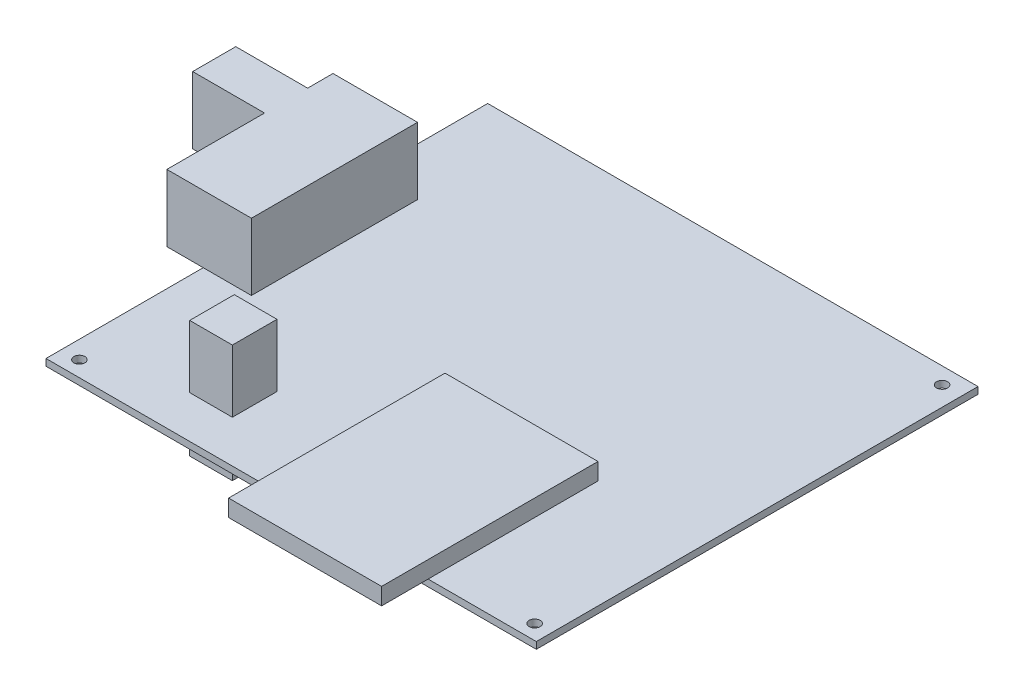
ISO-10303-21;
HEADER;
FILE_DESCRIPTION(('STEP AP214'),'2;1');
FILE_NAME('part.step','',(''),(''),'','','');
FILE_SCHEMA(('AUTOMOTIVE_DESIGN { 1 0 10303 214 1 1 1 1 }'));
ENDSEC;
DATA;
#1=APPLICATION_CONTEXT('core data for automotive mechanical design processes');
#2=APPLICATION_PROTOCOL_DEFINITION('international standard','automotive_design',2000,#1);
#3=PRODUCT_CONTEXT('',#1,'mechanical');
#4=PRODUCT('Part','Part','',(#3));
#5=PRODUCT_RELATED_PRODUCT_CATEGORY('part','',(#4));
#6=PRODUCT_DEFINITION_FORMATION('','',#4);
#7=PRODUCT_DEFINITION_CONTEXT('part definition',#1,'design');
#8=PRODUCT_DEFINITION('design','',#6,#7);
#9=PRODUCT_DEFINITION_SHAPE('','',#8);
#10=(LENGTH_UNIT() NAMED_UNIT(*) SI_UNIT(.MILLI.,.METRE.));
#11=(NAMED_UNIT(*) PLANE_ANGLE_UNIT() SI_UNIT($,.RADIAN.));
#12=(NAMED_UNIT(*) SI_UNIT($,.STERADIAN.) SOLID_ANGLE_UNIT());
#13=UNCERTAINTY_MEASURE_WITH_UNIT(LENGTH_MEASURE(1.E-05),#10,'distance_accuracy_value','');
#14=(GEOMETRIC_REPRESENTATION_CONTEXT(3) GLOBAL_UNCERTAINTY_ASSIGNED_CONTEXT((#13)) GLOBAL_UNIT_ASSIGNED_CONTEXT((#10,
#11,#12)) REPRESENTATION_CONTEXT('',''));
#15=CARTESIAN_POINT('',(0.,0.,0.));
#16=DIRECTION('',(0.,0.,1.));
#17=DIRECTION('',(1.,0.,0.));
#18=AXIS2_PLACEMENT_3D('',#15,#16,#17);
#19=CARTESIAN_POINT('',(0.,-0.8,0.));
#20=DIRECTION('',(0.,1.,0.));
#21=DIRECTION('',(0.,0.,1.));
#22=AXIS2_PLACEMENT_3D('',#19,#20,#21);
#23=PLANE('',#22);
#24=DIRECTION('',(1.,0.,0.));
#25=VECTOR('',#24,1.);
#26=CARTESIAN_POINT('',(0.,-0.8,-52.25));
#27=LINE('',#26,#25);
#28=CARTESIAN_POINT('',(0.,-0.8,-52.25));
#29=VERTEX_POINT('',#28);
#30=CARTESIAN_POINT('',(58.,-0.8,-52.25));
#31=VERTEX_POINT('',#30);
#32=EDGE_CURVE('E363',#29,#31,#27,.T.);
#33=ORIENTED_EDGE('',*,*,#32,.T.);
#34=DIRECTION('',(0.,0.,-1.));
#35=VECTOR('',#34,1.);
#36=CARTESIAN_POINT('',(58.,-0.8,0.));
#37=LINE('',#36,#35);
#38=CARTESIAN_POINT('',(58.,-0.8,0.));
#39=VERTEX_POINT('',#38);
#40=EDGE_CURVE('E370',#39,#31,#37,.T.);
#41=ORIENTED_EDGE('',*,*,#40,.F.);
#42=DIRECTION('',(1.,0.,0.));
#43=VECTOR('',#42,1.);
#44=CARTESIAN_POINT('',(0.,-0.8,0.));
#45=LINE('',#44,#43);
#46=CARTESIAN_POINT('',(0.,-0.8,0.));
#47=VERTEX_POINT('',#46);
#48=EDGE_CURVE('E367',#47,#39,#45,.T.);
#49=ORIENTED_EDGE('',*,*,#48,.F.);
#50=DIRECTION('',(0.,0.,-1.));
#51=VECTOR('',#50,1.);
#52=CARTESIAN_POINT('',(0.,-0.8,0.));
#53=LINE('',#52,#51);
#54=EDGE_CURVE('E365',#47,#29,#53,.T.);
#55=ORIENTED_EDGE('',*,*,#54,.T.);
#56=EDGE_LOOP('',(#33,#41,#49,#55));
#57=FACE_BOUND('',#56,.T.);
#58=CARTESIAN_POINT('',(2.1,-0.8,-1.85));
#59=DIRECTION('',(0.,1.,0.));
#60=DIRECTION('',(0.,0.,1.));
#61=AXIS2_PLACEMENT_3D('',#58,#59,#60);
#62=CIRCLE('',#61,0.65);
#63=CARTESIAN_POINT('',(2.1,-0.8,-1.2));
#64=VERTEX_POINT('',#63);
#65=EDGE_CURVE('E360',#64,#64,#62,.T.);
#66=ORIENTED_EDGE('',*,*,#65,.T.);
#67=EDGE_LOOP('',(#66));
#68=FACE_BOUND('',#67,.T.);
#69=CARTESIAN_POINT('',(56.05,-0.8,-1.75000000000001));
#70=DIRECTION('',(0.,1.,0.));
#71=DIRECTION('',(0.,0.,1.));
#72=AXIS2_PLACEMENT_3D('',#69,#70,#71);
#73=CIRCLE('',#72,0.649999999999997);
#74=CARTESIAN_POINT('',(56.05,-0.8,-1.10000000000001));
#75=VERTEX_POINT('',#74);
#76=EDGE_CURVE('E356',#75,#75,#73,.T.);
#77=ORIENTED_EDGE('',*,*,#76,.T.);
#78=EDGE_LOOP('',(#77));
#79=FACE_BOUND('',#78,.T.);
#80=CARTESIAN_POINT('',(55.7,-0.8,-50.3));
#81=DIRECTION('',(0.,1.,0.));
#82=DIRECTION('',(0.,0.,1.));
#83=AXIS2_PLACEMENT_3D('',#80,#81,#82);
#84=CIRCLE('',#83,0.649999999999997);
#85=CARTESIAN_POINT('',(55.7,-0.8,-49.65));
#86=VERTEX_POINT('',#85);
#87=EDGE_CURVE('E353',#86,#86,#84,.T.);
#88=ORIENTED_EDGE('',*,*,#87,.T.);
#89=EDGE_LOOP('',(#88));
#90=FACE_BOUND('',#89,.T.);
#91=DIRECTION('',(-1.,0.,0.));
#92=VECTOR('',#91,1.);
#93=CARTESIAN_POINT('',(0.,-0.8,-5.));
#94=LINE('',#93,#92);
#95=CARTESIAN_POINT('',(17.0479572916378,-0.8,-5.));
#96=VERTEX_POINT('',#95);
#97=CARTESIAN_POINT('',(12.,-0.8,-5.));
#98=VERTEX_POINT('',#97);
#99=EDGE_CURVE('E49',#96,#98,#94,.T.);
#100=ORIENTED_EDGE('',*,*,#99,.F.);
#101=DIRECTION('',(0.,0.,-1.));
#102=VECTOR('',#101,1.);
#103=CARTESIAN_POINT('',(17.0479572916378,-0.8,0.));
#104=LINE('',#103,#102);
#105=CARTESIAN_POINT('',(17.0479572916378,-0.8,-10.2760060902983));
#106=VERTEX_POINT('',#105);
#107=EDGE_CURVE('E53',#96,#106,#104,.T.);
#108=ORIENTED_EDGE('',*,*,#107,.T.);
#109=DIRECTION('',(-1.,0.,0.));
#110=VECTOR('',#109,1.);
#111=CARTESIAN_POINT('',(0.,-0.8,-10.2760060902983));
#112=LINE('',#111,#110);
#113=CARTESIAN_POINT('',(12.,-0.8,-10.2760060902983));
#114=VERTEX_POINT('',#113);
#115=EDGE_CURVE('E256',#106,#114,#112,.T.);
#116=ORIENTED_EDGE('',*,*,#115,.T.);
#117=DIRECTION('',(0.,0.,-1.));
#118=VECTOR('',#117,1.);
#119=CARTESIAN_POINT('',(12.,-0.8,0.));
#120=LINE('',#119,#118);
#121=EDGE_CURVE('E253',#98,#114,#120,.T.);
#122=ORIENTED_EDGE('',*,*,#121,.F.);
#123=EDGE_LOOP('',(#100,#108,#116,#122));
#124=FACE_BOUND('',#123,.T.);
#125=ADVANCED_FACE('F34',(#57,#68,#79,#90,#124),#23,.F.);
#126=CARTESIAN_POINT('',(0.,0.,0.));
#127=DIRECTION('',(0.,1.,0.));
#128=DIRECTION('',(0.,0.,1.));
#129=AXIS2_PLACEMENT_3D('',#126,#127,#128);
#130=PLANE('',#129);
#131=DIRECTION('',(0.,0.,1.));
#132=VECTOR('',#131,1.);
#133=CARTESIAN_POINT('',(27.1,0.,0.));
#134=LINE('',#133,#132);
#135=CARTESIAN_POINT('',(27.1,0.,-20.1));
#136=VERTEX_POINT('',#135);
#137=CARTESIAN_POINT('',(27.1,0.,0.));
#138=VERTEX_POINT('',#137);
#139=EDGE_CURVE('E408',#136,#138,#134,.T.);
#140=ORIENTED_EDGE('',*,*,#139,.F.);
#141=DIRECTION('',(1.,0.,0.));
#142=VECTOR('',#141,1.);
#143=CARTESIAN_POINT('',(0.,0.,-20.1));
#144=LINE('',#143,#142);
#145=CARTESIAN_POINT('',(45.2,0.,-20.1));
#146=VERTEX_POINT('',#145);
#147=EDGE_CURVE('E265',#136,#146,#144,.T.);
#148=ORIENTED_EDGE('',*,*,#147,.T.);
#149=DIRECTION('',(0.,0.,1.));
#150=VECTOR('',#149,1.);
#151=CARTESIAN_POINT('',(45.2,0.,0.));
#152=LINE('',#151,#150);
#153=CARTESIAN_POINT('',(45.2,0.,0.));
#154=VERTEX_POINT('',#153);
#155=EDGE_CURVE('E406',#146,#154,#152,.T.);
#156=ORIENTED_EDGE('',*,*,#155,.T.);
#157=DIRECTION('',(1.,0.,0.));
#158=VECTOR('',#157,1.);
#159=CARTESIAN_POINT('',(0.,0.,0.));
#160=LINE('',#159,#158);
#161=CARTESIAN_POINT('',(58.,0.,0.));
#162=VERTEX_POINT('',#161);
#163=EDGE_CURVE('E389',#154,#162,#160,.T.);
#164=ORIENTED_EDGE('',*,*,#163,.T.);
#165=DIRECTION('',(0.,0.,-1.));
#166=VECTOR('',#165,1.);
#167=CARTESIAN_POINT('',(58.,0.,0.));
#168=LINE('',#167,#166);
#169=CARTESIAN_POINT('',(58.,0.,-52.25));
#170=VERTEX_POINT('',#169);
#171=EDGE_CURVE('E357',#162,#170,#168,.T.);
#172=ORIENTED_EDGE('',*,*,#171,.T.);
#173=DIRECTION('',(1.,0.,0.));
#174=VECTOR('',#173,1.);
#175=CARTESIAN_POINT('',(0.,0.,-52.25));
#176=LINE('',#175,#174);
#177=CARTESIAN_POINT('',(0.,0.,-52.25));
#178=VERTEX_POINT('',#177);
#179=EDGE_CURVE('E382',#178,#170,#176,.T.);
#180=ORIENTED_EDGE('',*,*,#179,.F.);
#181=DIRECTION('',(0.,0.,-1.));
#182=VECTOR('',#181,1.);
#183=CARTESIAN_POINT('',(0.,0.,0.));
#184=LINE('',#183,#182);
#185=CARTESIAN_POINT('',(0.,0.,-38.25));
#186=VERTEX_POINT('',#185);
#187=EDGE_CURVE('E385',#186,#178,#184,.T.);
#188=ORIENTED_EDGE('',*,*,#187,.F.);
#189=DIRECTION('',(1.,0.,0.));
#190=VECTOR('',#189,1.);
#191=CARTESIAN_POINT('',(0.,0.,-38.25));
#192=LINE('',#191,#190);
#193=CARTESIAN_POINT('',(5.7,0.,-38.25));
#194=VERTEX_POINT('',#193);
#195=EDGE_CURVE('E318',#186,#194,#192,.T.);
#196=ORIENTED_EDGE('',*,*,#195,.T.);
#197=DIRECTION('',(0.,0.,1.));
#198=VECTOR('',#197,1.);
#199=CARTESIAN_POINT('',(5.70000000000001,0.,0.));
#200=LINE('',#199,#198);
#201=CARTESIAN_POINT('',(5.7,0.,-18.6));
#202=VERTEX_POINT('',#201);
#203=EDGE_CURVE('E291',#194,#202,#200,.T.);
#204=ORIENTED_EDGE('',*,*,#203,.T.);
#205=DIRECTION('',(1.,0.,0.));
#206=VECTOR('',#205,1.);
#207=CARTESIAN_POINT('',(0.,0.,-18.6));
#208=LINE('',#207,#206);
#209=CARTESIAN_POINT('',(0.,0.,-18.6));
#210=VERTEX_POINT('',#209);
#211=EDGE_CURVE('E331',#210,#202,#208,.T.);
#212=ORIENTED_EDGE('',*,*,#211,.F.);
#213=CARTESIAN_POINT('',(0.,0.,0.));
#214=VERTEX_POINT('',#213);
#215=EDGE_CURVE('E386',#214,#210,#184,.T.);
#216=ORIENTED_EDGE('',*,*,#215,.F.);
#217=EDGE_CURVE('E391',#214,#138,#160,.T.);
#218=ORIENTED_EDGE('',*,*,#217,.T.);
#219=EDGE_LOOP('',(#140,#148,#156,#164,#172,#180,#188,#196,#204,#212,#216,#218));
#220=FACE_BOUND('',#219,.T.);
#221=CARTESIAN_POINT('',(55.7,0.,-50.3));
#222=DIRECTION('',(0.,1.,0.));
#223=DIRECTION('',(0.,0.,1.));
#224=AXIS2_PLACEMENT_3D('',#221,#222,#223);
#225=CIRCLE('',#224,0.649999999999997);
#226=CARTESIAN_POINT('',(55.7,0.,-49.65));
#227=VERTEX_POINT('',#226);
#228=EDGE_CURVE('E352',#227,#227,#225,.T.);
#229=ORIENTED_EDGE('',*,*,#228,.F.);
#230=EDGE_LOOP('',(#229));
#231=FACE_BOUND('',#230,.T.);
#232=CARTESIAN_POINT('',(56.05,0.,-1.75000000000001));
#233=DIRECTION('',(0.,1.,0.));
#234=DIRECTION('',(0.,0.,1.));
#235=AXIS2_PLACEMENT_3D('',#232,#233,#234);
#236=CIRCLE('',#235,0.649999999999997);
#237=CARTESIAN_POINT('',(56.05,0.,-1.10000000000001));
#238=VERTEX_POINT('',#237);
#239=EDGE_CURVE('E376',#238,#238,#236,.T.);
#240=ORIENTED_EDGE('',*,*,#239,.F.);
#241=EDGE_LOOP('',(#240));
#242=FACE_BOUND('',#241,.T.);
#243=CARTESIAN_POINT('',(2.1,0.,-1.85));
#244=DIRECTION('',(0.,1.,0.));
#245=DIRECTION('',(0.,0.,1.));
#246=AXIS2_PLACEMENT_3D('',#243,#244,#245);
#247=CIRCLE('',#246,0.65);
#248=CARTESIAN_POINT('',(2.1,0.,-1.2));
#249=VERTEX_POINT('',#248);
#250=EDGE_CURVE('E379',#249,#249,#247,.T.);
#251=ORIENTED_EDGE('',*,*,#250,.F.);
#252=EDGE_LOOP('',(#251));
#253=FACE_BOUND('',#252,.T.);
#254=DIRECTION('',(0.,0.,-1.));
#255=VECTOR('',#254,1.);
#256=CARTESIAN_POINT('',(17.0479572916378,0.,0.));
#257=LINE('',#256,#255);
#258=CARTESIAN_POINT('',(17.0479572916378,0.,-5.));
#259=VERTEX_POINT('',#258);
#260=CARTESIAN_POINT('',(17.0479572916378,0.,-10.2760060902983));
#261=VERTEX_POINT('',#260);
#262=EDGE_CURVE('E42',#259,#261,#257,.T.);
#263=ORIENTED_EDGE('',*,*,#262,.F.);
#264=DIRECTION('',(-1.,0.,0.));
#265=VECTOR('',#264,1.);
#266=CARTESIAN_POINT('',(0.,0.,-5.));
#267=LINE('',#266,#265);
#268=CARTESIAN_POINT('',(12.,0.,-5.));
#269=VERTEX_POINT('',#268);
#270=EDGE_CURVE('E11',#259,#269,#267,.T.);
#271=ORIENTED_EDGE('',*,*,#270,.T.);
#272=DIRECTION('',(0.,0.,-1.));
#273=VECTOR('',#272,1.);
#274=CARTESIAN_POINT('',(12.,0.,0.));
#275=LINE('',#274,#273);
#276=CARTESIAN_POINT('',(12.,0.,-10.2760060902983));
#277=VERTEX_POINT('',#276);
#278=EDGE_CURVE('E411',#269,#277,#275,.T.);
#279=ORIENTED_EDGE('',*,*,#278,.T.);
#280=DIRECTION('',(-1.,0.,0.));
#281=VECTOR('',#280,1.);
#282=CARTESIAN_POINT('',(0.,0.,-10.2760060902983));
#283=LINE('',#282,#281);
#284=EDGE_CURVE('E414',#261,#277,#283,.T.);
#285=ORIENTED_EDGE('',*,*,#284,.F.);
#286=EDGE_LOOP('',(#263,#271,#279,#285));
#287=FACE_BOUND('',#286,.T.);
#288=ADVANCED_FACE('F426',(#220,#231,#242,#253,#287),#130,.T.);
#289=CARTESIAN_POINT('',(0.,-0.8,-52.25));
#290=DIRECTION('',(0.,0.,1.));
#291=DIRECTION('',(1.,0.,0.));
#292=AXIS2_PLACEMENT_3D('',#289,#290,#291);
#293=PLANE('',#292);
#294=ORIENTED_EDGE('',*,*,#179,.T.);
#295=DIRECTION('',(0.,1.,0.));
#296=VECTOR('',#295,1.);
#297=CARTESIAN_POINT('',(58.,-0.8,-52.25));
#298=LINE('',#297,#296);
#299=EDGE_CURVE('E397',#31,#170,#298,.T.);
#300=ORIENTED_EDGE('',*,*,#299,.F.);
#301=ORIENTED_EDGE('',*,*,#32,.F.);
#302=DIRECTION('',(0.,1.,0.));
#303=VECTOR('',#302,1.);
#304=CARTESIAN_POINT('',(0.,-0.8,-52.25));
#305=LINE('',#304,#303);
#306=EDGE_CURVE('E373',#29,#178,#305,.T.);
#307=ORIENTED_EDGE('',*,*,#306,.T.);
#308=EDGE_LOOP('',(#294,#300,#301,#307));
#309=FACE_BOUND('',#308,.T.);
#310=ADVANCED_FACE('F455',(#309),#293,.F.);
#311=CARTESIAN_POINT('',(58.,-0.8,0.));
#312=DIRECTION('',(1.,0.,0.));
#313=DIRECTION('',(0.,0.,-1.));
#314=AXIS2_PLACEMENT_3D('',#311,#312,#313);
#315=PLANE('',#314);
#316=ORIENTED_EDGE('',*,*,#171,.F.);
#317=DIRECTION('',(0.,1.,0.));
#318=VECTOR('',#317,1.);
#319=CARTESIAN_POINT('',(58.,-0.8,0.));
#320=LINE('',#319,#318);
#321=EDGE_CURVE('E399',#39,#162,#320,.T.);
#322=ORIENTED_EDGE('',*,*,#321,.F.);
#323=ORIENTED_EDGE('',*,*,#40,.T.);
#324=ORIENTED_EDGE('',*,*,#299,.T.);
#325=EDGE_LOOP('',(#316,#322,#323,#324));
#326=FACE_BOUND('',#325,.T.);
#327=ADVANCED_FACE('F463',(#326),#315,.T.);
#328=CARTESIAN_POINT('',(0.,-0.8,0.));
#329=DIRECTION('',(0.,0.,1.));
#330=DIRECTION('',(1.,0.,0.));
#331=AXIS2_PLACEMENT_3D('',#328,#329,#330);
#332=PLANE('',#331);
#333=ORIENTED_EDGE('',*,*,#217,.F.);
#334=DIRECTION('',(0.,1.,0.));
#335=VECTOR('',#334,1.);
#336=CARTESIAN_POINT('',(0.,-0.8,0.));
#337=LINE('',#336,#335);
#338=EDGE_CURVE('E402',#47,#214,#337,.T.);
#339=ORIENTED_EDGE('',*,*,#338,.F.);
#340=ORIENTED_EDGE('',*,*,#48,.T.);
#341=ORIENTED_EDGE('',*,*,#321,.T.);
#342=ORIENTED_EDGE('',*,*,#163,.F.);
#343=EDGE_CURVE('E394',#138,#154,#160,.T.);
#344=ORIENTED_EDGE('',*,*,#343,.F.);
#345=EDGE_LOOP('',(#333,#339,#340,#341,#342,#344));
#346=FACE_BOUND('',#345,.T.);
#347=ADVANCED_FACE('F466',(#346),#332,.T.);
#348=CARTESIAN_POINT('',(2.1,-0.8,-1.85));
#349=DIRECTION('',(0.,1.,0.));
#350=DIRECTION('',(0.,0.,1.));
#351=AXIS2_PLACEMENT_3D('',#348,#349,#350);
#352=CYLINDRICAL_SURFACE('',#351,0.65);
#353=ORIENTED_EDGE('',*,*,#65,.F.);
#354=EDGE_LOOP('',(#353));
#355=FACE_BOUND('',#354,.T.);
#356=ORIENTED_EDGE('',*,*,#250,.T.);
#357=EDGE_LOOP('',(#356));
#358=FACE_BOUND('',#357,.T.);
#359=ADVANCED_FACE('F470',(#355,#358),#352,.F.);
#360=CARTESIAN_POINT('',(56.05,-0.8,-1.75000000000001));
#361=DIRECTION('',(0.,1.,0.));
#362=DIRECTION('',(0.,0.,1.));
#363=AXIS2_PLACEMENT_3D('',#360,#361,#362);
#364=CYLINDRICAL_SURFACE('',#363,0.649999999999997);
#365=ORIENTED_EDGE('',*,*,#76,.F.);
#366=EDGE_LOOP('',(#365));
#367=FACE_BOUND('',#366,.T.);
#368=ORIENTED_EDGE('',*,*,#239,.T.);
#369=EDGE_LOOP('',(#368));
#370=FACE_BOUND('',#369,.T.);
#371=ADVANCED_FACE('F480',(#367,#370),#364,.F.);
#372=CARTESIAN_POINT('',(55.7,-0.8,-50.3));
#373=DIRECTION('',(0.,1.,0.));
#374=DIRECTION('',(0.,0.,1.));
#375=AXIS2_PLACEMENT_3D('',#372,#373,#374);
#376=CYLINDRICAL_SURFACE('',#375,0.649999999999997);
#377=ORIENTED_EDGE('',*,*,#87,.F.);
#378=EDGE_LOOP('',(#377));
#379=FACE_BOUND('',#378,.T.);
#380=ORIENTED_EDGE('',*,*,#228,.T.);
#381=EDGE_LOOP('',(#380));
#382=FACE_BOUND('',#381,.T.);
#383=ADVANCED_FACE('F36',(#379,#382),#376,.F.);
#384=CARTESIAN_POINT('',(0.,-0.8,0.));
#385=DIRECTION('',(1.,0.,0.));
#386=DIRECTION('',(0.,0.,-1.));
#387=AXIS2_PLACEMENT_3D('',#384,#385,#386);
#388=PLANE('',#387);
#389=ORIENTED_EDGE('',*,*,#215,.T.);
#390=EDGE_CURVE('E390',#210,#186,#184,.T.);
#391=ORIENTED_EDGE('',*,*,#390,.T.);
#392=ORIENTED_EDGE('',*,*,#187,.T.);
#393=ORIENTED_EDGE('',*,*,#306,.F.);
#394=ORIENTED_EDGE('',*,*,#54,.F.);
#395=ORIENTED_EDGE('',*,*,#338,.T.);
#396=EDGE_LOOP('',(#389,#391,#392,#393,#394,#395));
#397=FACE_BOUND('',#396,.T.);
#398=ADVANCED_FACE('F472',(#397),#388,.F.);
#399=CARTESIAN_POINT('',(5.70000000000001,7.92,0.));
#400=DIRECTION('',(1.,0.,0.));
#401=DIRECTION('',(0.,0.,-1.));
#402=AXIS2_PLACEMENT_3D('',#399,#400,#401);
#403=PLANE('',#402);
#404=ORIENTED_EDGE('',*,*,#203,.F.);
#405=DIRECTION('',(0.,-1.,0.));
#406=VECTOR('',#405,1.);
#407=CARTESIAN_POINT('',(5.7,7.92,-38.25));
#408=LINE('',#407,#406);
#409=CARTESIAN_POINT('',(5.7,7.92,-38.25));
#410=VERTEX_POINT('',#409);
#411=EDGE_CURVE('E349',#410,#194,#408,.T.);
#412=ORIENTED_EDGE('',*,*,#411,.F.);
#413=DIRECTION('',(0.,0.,1.));
#414=VECTOR('',#413,1.);
#415=CARTESIAN_POINT('',(5.70000000000001,7.92,0.));
#416=LINE('',#415,#414);
#417=CARTESIAN_POINT('',(5.7,7.92,-18.6));
#418=VERTEX_POINT('',#417);
#419=EDGE_CURVE('E292',#410,#418,#416,.T.);
#420=ORIENTED_EDGE('',*,*,#419,.T.);
#421=DIRECTION('',(0.,-1.,0.));
#422=VECTOR('',#421,1.);
#423=CARTESIAN_POINT('',(5.7,7.92,-18.6));
#424=LINE('',#423,#422);
#425=EDGE_CURVE('E311',#418,#202,#424,.T.);
#426=ORIENTED_EDGE('',*,*,#425,.T.);
#427=EDGE_LOOP('',(#404,#412,#420,#426));
#428=FACE_BOUND('',#427,.T.);
#429=ADVANCED_FACE('F460',(#428),#403,.T.);
#430=CARTESIAN_POINT('',(0.,7.92,-38.25));
#431=DIRECTION('',(0.,0.,-1.));
#432=DIRECTION('',(-1.,0.,0.));
#433=AXIS2_PLACEMENT_3D('',#430,#431,#432);
#434=PLANE('',#433);
#435=CARTESIAN_POINT('',(-4.3,0.,-38.25));
#436=VERTEX_POINT('',#435);
#437=EDGE_CURVE('E314',#436,#186,#192,.T.);
#438=ORIENTED_EDGE('',*,*,#437,.F.);
#439=DIRECTION('',(0.,-1.,0.));
#440=VECTOR('',#439,1.);
#441=CARTESIAN_POINT('',(-4.3,7.92,-38.25));
#442=LINE('',#441,#440);
#443=CARTESIAN_POINT('',(-4.3,7.92,-38.25));
#444=VERTEX_POINT('',#443);
#445=EDGE_CURVE('E347',#444,#436,#442,.T.);
#446=ORIENTED_EDGE('',*,*,#445,.F.);
#447=DIRECTION('',(1.,0.,0.));
#448=VECTOR('',#447,1.);
#449=CARTESIAN_POINT('',(0.,7.92,-38.25));
#450=LINE('',#449,#448);
#451=EDGE_CURVE('E295',#444,#410,#450,.T.);
#452=ORIENTED_EDGE('',*,*,#451,.T.);
#453=ORIENTED_EDGE('',*,*,#411,.T.);
#454=ORIENTED_EDGE('',*,*,#195,.F.);
#455=EDGE_LOOP('',(#438,#446,#452,#453,#454));
#456=FACE_BOUND('',#455,.T.);
#457=ADVANCED_FACE('F513',(#456),#434,.T.);
#458=CARTESIAN_POINT('',(-4.29999999999999,7.92,0.));
#459=DIRECTION('',(1.,0.,0.));
#460=DIRECTION('',(0.,0.,-1.));
#461=AXIS2_PLACEMENT_3D('',#458,#459,#460);
#462=PLANE('',#461);
#463=DIRECTION('',(0.,0.,1.));
#464=VECTOR('',#463,1.);
#465=CARTESIAN_POINT('',(-4.29999999999999,0.,0.));
#466=LINE('',#465,#464);
#467=CARTESIAN_POINT('',(-4.3,0.,-35.25));
#468=VERTEX_POINT('',#467);
#469=EDGE_CURVE('E317',#436,#468,#466,.T.);
#470=ORIENTED_EDGE('',*,*,#469,.T.);
#471=DIRECTION('',(0.,-1.,0.));
#472=VECTOR('',#471,1.);
#473=CARTESIAN_POINT('',(-4.3,7.92,-35.25));
#474=LINE('',#473,#472);
#475=CARTESIAN_POINT('',(-4.3,7.92,-35.25));
#476=VERTEX_POINT('',#475);
#477=EDGE_CURVE('E344',#476,#468,#474,.T.);
#478=ORIENTED_EDGE('',*,*,#477,.F.);
#479=DIRECTION('',(0.,0.,1.));
#480=VECTOR('',#479,1.);
#481=CARTESIAN_POINT('',(-4.29999999999999,7.92,0.));
#482=LINE('',#481,#480);
#483=EDGE_CURVE('E299',#444,#476,#482,.T.);
#484=ORIENTED_EDGE('',*,*,#483,.F.);
#485=ORIENTED_EDGE('',*,*,#445,.T.);
#486=EDGE_LOOP('',(#470,#478,#484,#485));
#487=FACE_BOUND('',#486,.T.);
#488=ADVANCED_FACE('F520',(#487),#462,.F.);
#489=CARTESIAN_POINT('',(0.,7.92,-35.25));
#490=DIRECTION('',(0.,0.,1.));
#491=DIRECTION('',(1.,0.,0.));
#492=AXIS2_PLACEMENT_3D('',#489,#490,#491);
#493=PLANE('',#492);
#494=DIRECTION('',(-1.,0.,0.));
#495=VECTOR('',#494,1.);
#496=CARTESIAN_POINT('',(0.,0.,-35.25));
#497=LINE('',#496,#495);
#498=CARTESIAN_POINT('',(-12.8,0.,-35.25));
#499=VERTEX_POINT('',#498);
#500=EDGE_CURVE('E320',#468,#499,#497,.T.);
#501=ORIENTED_EDGE('',*,*,#500,.T.);
#502=DIRECTION('',(0.,-1.,0.));
#503=VECTOR('',#502,1.);
#504=CARTESIAN_POINT('',(-12.8,7.92,-35.25));
#505=LINE('',#504,#503);
#506=CARTESIAN_POINT('',(-12.8,7.92,-35.25));
#507=VERTEX_POINT('',#506);
#508=EDGE_CURVE('E341',#507,#499,#505,.T.);
#509=ORIENTED_EDGE('',*,*,#508,.F.);
#510=DIRECTION('',(-1.,0.,0.));
#511=VECTOR('',#510,1.);
#512=CARTESIAN_POINT('',(0.,7.92,-35.25));
#513=LINE('',#512,#511);
#514=EDGE_CURVE('E301',#476,#507,#513,.T.);
#515=ORIENTED_EDGE('',*,*,#514,.F.);
#516=ORIENTED_EDGE('',*,*,#477,.T.);
#517=EDGE_LOOP('',(#501,#509,#515,#516));
#518=FACE_BOUND('',#517,.T.);
#519=ADVANCED_FACE('F527',(#518),#493,.F.);
#520=CARTESIAN_POINT('',(-12.8,7.92,0.));
#521=DIRECTION('',(1.,0.,0.));
#522=DIRECTION('',(0.,0.,-1.));
#523=AXIS2_PLACEMENT_3D('',#520,#521,#522);
#524=PLANE('',#523);
#525=DIRECTION('',(0.,0.,1.));
#526=VECTOR('',#525,1.);
#527=CARTESIAN_POINT('',(-12.8,0.,0.));
#528=LINE('',#527,#526);
#529=CARTESIAN_POINT('',(-12.8,0.,-30.15));
#530=VERTEX_POINT('',#529);
#531=EDGE_CURVE('E323',#499,#530,#528,.T.);
#532=ORIENTED_EDGE('',*,*,#531,.T.);
#533=DIRECTION('',(0.,-1.,0.));
#534=VECTOR('',#533,1.);
#535=CARTESIAN_POINT('',(-12.8,7.92,-30.15));
#536=LINE('',#535,#534);
#537=CARTESIAN_POINT('',(-12.8,7.92,-30.15));
#538=VERTEX_POINT('',#537);
#539=EDGE_CURVE('E339',#538,#530,#536,.T.);
#540=ORIENTED_EDGE('',*,*,#539,.F.);
#541=DIRECTION('',(0.,0.,1.));
#542=VECTOR('',#541,1.);
#543=CARTESIAN_POINT('',(-12.8,7.92,0.));
#544=LINE('',#543,#542);
#545=EDGE_CURVE('E304',#507,#538,#544,.T.);
#546=ORIENTED_EDGE('',*,*,#545,.F.);
#547=ORIENTED_EDGE('',*,*,#508,.T.);
#548=EDGE_LOOP('',(#532,#540,#546,#547));
#549=FACE_BOUND('',#548,.T.);
#550=ADVANCED_FACE('F536',(#549),#524,.F.);
#551=CARTESIAN_POINT('',(0.,7.92,-30.15));
#552=DIRECTION('',(0.,0.,1.));
#553=DIRECTION('',(1.,0.,0.));
#554=AXIS2_PLACEMENT_3D('',#551,#552,#553);
#555=PLANE('',#554);
#556=DIRECTION('',(-1.,0.,0.));
#557=VECTOR('',#556,1.);
#558=CARTESIAN_POINT('',(0.,0.,-30.15));
#559=LINE('',#558,#557);
#560=CARTESIAN_POINT('',(-4.3,0.,-30.15));
#561=VERTEX_POINT('',#560);
#562=EDGE_CURVE('E326',#561,#530,#559,.T.);
#563=ORIENTED_EDGE('',*,*,#562,.F.);
#564=DIRECTION('',(0.,-1.,0.));
#565=VECTOR('',#564,1.);
#566=CARTESIAN_POINT('',(-4.3,7.92,-30.15));
#567=LINE('',#566,#565);
#568=CARTESIAN_POINT('',(-4.3,7.92,-30.15));
#569=VERTEX_POINT('',#568);
#570=EDGE_CURVE('E337',#569,#561,#567,.T.);
#571=ORIENTED_EDGE('',*,*,#570,.F.);
#572=DIRECTION('',(-1.,0.,0.));
#573=VECTOR('',#572,1.);
#574=CARTESIAN_POINT('',(0.,7.92,-30.15));
#575=LINE('',#574,#573);
#576=EDGE_CURVE('E306',#569,#538,#575,.T.);
#577=ORIENTED_EDGE('',*,*,#576,.T.);
#578=ORIENTED_EDGE('',*,*,#539,.T.);
#579=EDGE_LOOP('',(#563,#571,#577,#578));
#580=FACE_BOUND('',#579,.T.);
#581=ADVANCED_FACE('F544',(#580),#555,.T.);
#582=CARTESIAN_POINT('',(-4.3,0.,-18.6));
#583=VERTEX_POINT('',#582);
#584=EDGE_CURVE('E321',#561,#583,#466,.T.);
#585=ORIENTED_EDGE('',*,*,#584,.T.);
#586=DIRECTION('',(0.,-1.,0.));
#587=VECTOR('',#586,1.);
#588=CARTESIAN_POINT('',(-4.3,7.92,-18.6));
#589=LINE('',#588,#587);
#590=CARTESIAN_POINT('',(-4.3,7.92,-18.6));
#591=VERTEX_POINT('',#590);
#592=EDGE_CURVE('E334',#591,#583,#589,.T.);
#593=ORIENTED_EDGE('',*,*,#592,.F.);
#594=EDGE_CURVE('E302',#569,#591,#482,.T.);
#595=ORIENTED_EDGE('',*,*,#594,.F.);
#596=ORIENTED_EDGE('',*,*,#570,.T.);
#597=EDGE_LOOP('',(#585,#593,#595,#596));
#598=FACE_BOUND('',#597,.T.);
#599=ADVANCED_FACE('F530',(#598),#462,.F.);
#600=CARTESIAN_POINT('',(0.,7.92,-18.6));
#601=DIRECTION('',(0.,0.,-1.));
#602=DIRECTION('',(-1.,0.,0.));
#603=AXIS2_PLACEMENT_3D('',#600,#601,#602);
#604=PLANE('',#603);
#605=EDGE_CURVE('E296',#583,#210,#208,.T.);
#606=ORIENTED_EDGE('',*,*,#605,.T.);
#607=ORIENTED_EDGE('',*,*,#211,.T.);
#608=ORIENTED_EDGE('',*,*,#425,.F.);
#609=DIRECTION('',(1.,0.,0.));
#610=VECTOR('',#609,1.);
#611=CARTESIAN_POINT('',(0.,7.92,-18.6));
#612=LINE('',#611,#610);
#613=EDGE_CURVE('E309',#591,#418,#612,.T.);
#614=ORIENTED_EDGE('',*,*,#613,.F.);
#615=ORIENTED_EDGE('',*,*,#592,.T.);
#616=EDGE_LOOP('',(#606,#607,#608,#614,#615));
#617=FACE_BOUND('',#616,.T.);
#618=ADVANCED_FACE('F559',(#617),#604,.F.);
#619=CARTESIAN_POINT('',(0.,7.92,0.));
#620=DIRECTION('',(0.,1.,0.));
#621=DIRECTION('',(0.,0.,1.));
#622=AXIS2_PLACEMENT_3D('',#619,#620,#621);
#623=PLANE('',#622);
#624=ORIENTED_EDGE('',*,*,#419,.F.);
#625=ORIENTED_EDGE('',*,*,#451,.F.);
#626=ORIENTED_EDGE('',*,*,#483,.T.);
#627=ORIENTED_EDGE('',*,*,#514,.T.);
#628=ORIENTED_EDGE('',*,*,#545,.T.);
#629=ORIENTED_EDGE('',*,*,#576,.F.);
#630=ORIENTED_EDGE('',*,*,#594,.T.);
#631=ORIENTED_EDGE('',*,*,#613,.T.);
#632=EDGE_LOOP('',(#624,#625,#626,#627,#628,#629,#630,#631));
#633=FACE_BOUND('',#632,.T.);
#634=ADVANCED_FACE('F566',(#633),#623,.T.);
#635=CARTESIAN_POINT('',(0.,0.,0.));
#636=DIRECTION('',(0.,1.,0.));
#637=DIRECTION('',(0.,0.,1.));
#638=AXIS2_PLACEMENT_3D('',#635,#636,#637);
#639=PLANE('',#638);
#640=ORIENTED_EDGE('',*,*,#390,.F.);
#641=ORIENTED_EDGE('',*,*,#605,.F.);
#642=ORIENTED_EDGE('',*,*,#584,.F.);
#643=ORIENTED_EDGE('',*,*,#562,.T.);
#644=ORIENTED_EDGE('',*,*,#531,.F.);
#645=ORIENTED_EDGE('',*,*,#500,.F.);
#646=ORIENTED_EDGE('',*,*,#469,.F.);
#647=ORIENTED_EDGE('',*,*,#437,.T.);
#648=EDGE_LOOP('',(#640,#641,#642,#643,#644,#645,#646,#647));
#649=FACE_BOUND('',#648,.T.);
#650=ADVANCED_FACE('F574',(#649),#639,.F.);
#651=CARTESIAN_POINT('',(27.1,2.,0.));
#652=DIRECTION('',(-1.,0.,0.));
#653=DIRECTION('',(0.,0.,1.));
#654=AXIS2_PLACEMENT_3D('',#651,#652,#653);
#655=PLANE('',#654);
#656=DIRECTION('',(0.,0.,-1.));
#657=VECTOR('',#656,1.);
#658=CARTESIAN_POINT('',(27.1,0.,0.));
#659=LINE('',#658,#657);
#660=CARTESIAN_POINT('',(27.1,0.,5.5));
#661=VERTEX_POINT('',#660);
#662=EDGE_CURVE('E260',#661,#138,#659,.T.);
#663=ORIENTED_EDGE('',*,*,#662,.F.);
#664=DIRECTION('',(0.,-1.,0.));
#665=VECTOR('',#664,1.);
#666=CARTESIAN_POINT('',(27.1,2.,5.5));
#667=LINE('',#666,#665);
#668=CARTESIAN_POINT('',(27.1,2.,5.5));
#669=VERTEX_POINT('',#668);
#670=EDGE_CURVE('E289',#669,#661,#667,.T.);
#671=ORIENTED_EDGE('',*,*,#670,.F.);
#672=DIRECTION('',(0.,0.,-1.));
#673=VECTOR('',#672,1.);
#674=CARTESIAN_POINT('',(27.1,2.,0.));
#675=LINE('',#674,#673);
#676=CARTESIAN_POINT('',(27.1,2.,-20.1));
#677=VERTEX_POINT('',#676);
#678=EDGE_CURVE('E261',#669,#677,#675,.T.);
#679=ORIENTED_EDGE('',*,*,#678,.T.);
#680=DIRECTION('',(0.,-1.,0.));
#681=VECTOR('',#680,1.);
#682=CARTESIAN_POINT('',(27.1,2.,-20.1));
#683=LINE('',#682,#681);
#684=EDGE_CURVE('E272',#677,#136,#683,.T.);
#685=ORIENTED_EDGE('',*,*,#684,.T.);
#686=ORIENTED_EDGE('',*,*,#139,.T.);
#687=EDGE_LOOP('',(#663,#671,#679,#685,#686));
#688=FACE_BOUND('',#687,.T.);
#689=ADVANCED_FACE('F582',(#688),#655,.T.);
#690=CARTESIAN_POINT('',(0.,2.,5.5));
#691=DIRECTION('',(0.,0.,-1.));
#692=DIRECTION('',(-1.,0.,0.));
#693=AXIS2_PLACEMENT_3D('',#690,#691,#692);
#694=PLANE('',#693);
#695=DIRECTION('',(1.,0.,0.));
#696=VECTOR('',#695,1.);
#697=CARTESIAN_POINT('',(0.,0.,5.5));
#698=LINE('',#697,#696);
#699=CARTESIAN_POINT('',(45.2,0.,5.5));
#700=VERTEX_POINT('',#699);
#701=EDGE_CURVE('E275',#661,#700,#698,.T.);
#702=ORIENTED_EDGE('',*,*,#701,.T.);
#703=DIRECTION('',(0.,-1.,0.));
#704=VECTOR('',#703,1.);
#705=CARTESIAN_POINT('',(45.2,2.,5.5));
#706=LINE('',#705,#704);
#707=CARTESIAN_POINT('',(45.2,2.,5.5));
#708=VERTEX_POINT('',#707);
#709=EDGE_CURVE('E286',#708,#700,#706,.T.);
#710=ORIENTED_EDGE('',*,*,#709,.F.);
#711=DIRECTION('',(1.,0.,0.));
#712=VECTOR('',#711,1.);
#713=CARTESIAN_POINT('',(0.,2.,5.5));
#714=LINE('',#713,#712);
#715=EDGE_CURVE('E264',#669,#708,#714,.T.);
#716=ORIENTED_EDGE('',*,*,#715,.F.);
#717=ORIENTED_EDGE('',*,*,#670,.T.);
#718=EDGE_LOOP('',(#702,#710,#716,#717));
#719=FACE_BOUND('',#718,.T.);
#720=ADVANCED_FACE('F591',(#719),#694,.F.);
#721=CARTESIAN_POINT('',(45.2,2.,0.));
#722=DIRECTION('',(-1.,0.,0.));
#723=DIRECTION('',(0.,0.,1.));
#724=AXIS2_PLACEMENT_3D('',#721,#722,#723);
#725=PLANE('',#724);
#726=DIRECTION('',(0.,0.,-1.));
#727=VECTOR('',#726,1.);
#728=CARTESIAN_POINT('',(45.2,0.,0.));
#729=LINE('',#728,#727);
#730=EDGE_CURVE('E277',#700,#154,#729,.T.);
#731=ORIENTED_EDGE('',*,*,#730,.T.);
#732=ORIENTED_EDGE('',*,*,#155,.F.);
#733=DIRECTION('',(0.,-1.,0.));
#734=VECTOR('',#733,1.);
#735=CARTESIAN_POINT('',(45.2,2.,-20.1));
#736=LINE('',#735,#734);
#737=CARTESIAN_POINT('',(45.2,2.,-20.1));
#738=VERTEX_POINT('',#737);
#739=EDGE_CURVE('E283',#738,#146,#736,.T.);
#740=ORIENTED_EDGE('',*,*,#739,.F.);
#741=DIRECTION('',(0.,0.,-1.));
#742=VECTOR('',#741,1.);
#743=CARTESIAN_POINT('',(45.2,2.,0.));
#744=LINE('',#743,#742);
#745=EDGE_CURVE('E267',#708,#738,#744,.T.);
#746=ORIENTED_EDGE('',*,*,#745,.F.);
#747=ORIENTED_EDGE('',*,*,#709,.T.);
#748=EDGE_LOOP('',(#731,#732,#740,#746,#747));
#749=FACE_BOUND('',#748,.T.);
#750=ADVANCED_FACE('F599',(#749),#725,.F.);
#751=CARTESIAN_POINT('',(0.,2.,-20.1));
#752=DIRECTION('',(0.,0.,-1.));
#753=DIRECTION('',(-1.,0.,0.));
#754=AXIS2_PLACEMENT_3D('',#751,#752,#753);
#755=PLANE('',#754);
#756=ORIENTED_EDGE('',*,*,#147,.F.);
#757=ORIENTED_EDGE('',*,*,#684,.F.);
#758=DIRECTION('',(1.,0.,0.));
#759=VECTOR('',#758,1.);
#760=CARTESIAN_POINT('',(0.,2.,-20.1));
#761=LINE('',#760,#759);
#762=EDGE_CURVE('E269',#677,#738,#761,.T.);
#763=ORIENTED_EDGE('',*,*,#762,.T.);
#764=ORIENTED_EDGE('',*,*,#739,.T.);
#765=EDGE_LOOP('',(#756,#757,#763,#764));
#766=FACE_BOUND('',#765,.T.);
#767=ADVANCED_FACE('F607',(#766),#755,.T.);
#768=CARTESIAN_POINT('',(0.,2.,0.));
#769=DIRECTION('',(0.,1.,0.));
#770=DIRECTION('',(0.,0.,1.));
#771=AXIS2_PLACEMENT_3D('',#768,#769,#770);
#772=PLANE('',#771);
#773=ORIENTED_EDGE('',*,*,#678,.F.);
#774=ORIENTED_EDGE('',*,*,#715,.T.);
#775=ORIENTED_EDGE('',*,*,#745,.T.);
#776=ORIENTED_EDGE('',*,*,#762,.F.);
#777=EDGE_LOOP('',(#773,#774,#775,#776));
#778=FACE_BOUND('',#777,.T.);
#779=ADVANCED_FACE('F445',(#778),#772,.T.);
#780=CARTESIAN_POINT('',(0.,0.,0.));
#781=DIRECTION('',(0.,1.,0.));
#782=DIRECTION('',(0.,0.,1.));
#783=AXIS2_PLACEMENT_3D('',#780,#781,#782);
#784=PLANE('',#783);
#785=ORIENTED_EDGE('',*,*,#343,.T.);
#786=ORIENTED_EDGE('',*,*,#730,.F.);
#787=ORIENTED_EDGE('',*,*,#701,.F.);
#788=ORIENTED_EDGE('',*,*,#662,.T.);
#789=EDGE_LOOP('',(#785,#786,#787,#788));
#790=FACE_BOUND('',#789,.T.);
#791=ADVANCED_FACE('F437',(#790),#784,.F.);
#792=CARTESIAN_POINT('',(0.,7.4,0.));
#793=DIRECTION('',(0.,-1.,0.));
#794=DIRECTION('',(0.,0.,-1.));
#795=AXIS2_PLACEMENT_3D('',#792,#793,#794);
#796=PLANE('',#795);
#797=DIRECTION('',(1.,0.,0.));
#798=VECTOR('',#797,1.);
#799=CARTESIAN_POINT('',(0.,7.4,-5.));
#800=LINE('',#799,#798);
#801=CARTESIAN_POINT('',(12.,7.4,-5.));
#802=VERTEX_POINT('',#801);
#803=CARTESIAN_POINT('',(17.0479572916378,7.4,-5.));
#804=VERTEX_POINT('',#803);
#805=EDGE_CURVE('E233',#802,#804,#800,.T.);
#806=ORIENTED_EDGE('',*,*,#805,.T.);
#807=DIRECTION('',(0.,0.,1.));
#808=VECTOR('',#807,1.);
#809=CARTESIAN_POINT('',(17.0479572916378,7.4,0.));
#810=LINE('',#809,#808);
#811=CARTESIAN_POINT('',(17.0479572916378,7.4,-10.2760060902983));
#812=VERTEX_POINT('',#811);
#813=EDGE_CURVE('E235',#812,#804,#810,.T.);
#814=ORIENTED_EDGE('',*,*,#813,.F.);
#815=DIRECTION('',(1.,0.,0.));
#816=VECTOR('',#815,1.);
#817=CARTESIAN_POINT('',(0.,7.4,-10.2760060902983));
#818=LINE('',#817,#816);
#819=CARTESIAN_POINT('',(12.,7.4,-10.2760060902983));
#820=VERTEX_POINT('',#819);
#821=EDGE_CURVE('E238',#820,#812,#818,.T.);
#822=ORIENTED_EDGE('',*,*,#821,.F.);
#823=DIRECTION('',(0.,0.,1.));
#824=VECTOR('',#823,1.);
#825=CARTESIAN_POINT('',(12.,7.4,0.));
#826=LINE('',#825,#824);
#827=EDGE_CURVE('E241',#820,#802,#826,.T.);
#828=ORIENTED_EDGE('',*,*,#827,.T.);
#829=EDGE_LOOP('',(#806,#814,#822,#828));
#830=FACE_BOUND('',#829,.T.);
#831=ADVANCED_FACE('F435',(#830),#796,.F.);
#832=CARTESIAN_POINT('',(12.,7.4,0.));
#833=DIRECTION('',(1.,0.,0.));
#834=DIRECTION('',(0.,0.,-1.));
#835=AXIS2_PLACEMENT_3D('',#832,#833,#834);
#836=PLANE('',#835);
#837=ORIENTED_EDGE('',*,*,#278,.F.);
#838=DIRECTION('',(0.,-1.,0.));
#839=VECTOR('',#838,1.);
#840=CARTESIAN_POINT('',(12.,7.4,-5.));
#841=LINE('',#840,#839);
#842=EDGE_CURVE('E243',#802,#269,#841,.T.);
#843=ORIENTED_EDGE('',*,*,#842,.F.);
#844=ORIENTED_EDGE('',*,*,#827,.F.);
#845=DIRECTION('',(0.,-1.,0.));
#846=VECTOR('',#845,1.);
#847=CARTESIAN_POINT('',(12.,7.4,-10.2760060902983));
#848=LINE('',#847,#846);
#849=EDGE_CURVE('E247',#820,#277,#848,.T.);
#850=ORIENTED_EDGE('',*,*,#849,.T.);
#851=EDGE_LOOP('',(#837,#843,#844,#850));
#852=FACE_BOUND('',#851,.T.);
#853=ADVANCED_FACE('F429',(#852),#836,.F.);
#854=CARTESIAN_POINT('',(0.,7.4,-10.2760060902983));
#855=DIRECTION('',(0.,0.,-1.));
#856=DIRECTION('',(-1.,0.,0.));
#857=AXIS2_PLACEMENT_3D('',#854,#855,#856);
#858=PLANE('',#857);
#859=DIRECTION('',(0.,-1.,0.));
#860=VECTOR('',#859,1.);
#861=CARTESIAN_POINT('',(17.0479572916378,7.4,-10.2760060902983));
#862=LINE('',#861,#860);
#863=EDGE_CURVE('E213',#812,#261,#862,.T.);
#864=ORIENTED_EDGE('',*,*,#863,.T.);
#865=ORIENTED_EDGE('',*,*,#284,.T.);
#866=ORIENTED_EDGE('',*,*,#849,.F.);
#867=ORIENTED_EDGE('',*,*,#821,.T.);
#868=EDGE_LOOP('',(#864,#865,#866,#867));
#869=FACE_BOUND('',#868,.T.);
#870=ADVANCED_FACE('F424',(#869),#858,.T.);
#871=CARTESIAN_POINT('',(17.0479572916378,7.4,0.));
#872=DIRECTION('',(1.,0.,0.));
#873=DIRECTION('',(0.,0.,-1.));
#874=AXIS2_PLACEMENT_3D('',#871,#872,#873);
#875=PLANE('',#874);
#876=DIRECTION('',(0.,-1.,0.));
#877=VECTOR('',#876,1.);
#878=CARTESIAN_POINT('',(17.0479572916378,7.4,-5.));
#879=LINE('',#878,#877);
#880=EDGE_CURVE('E212',#804,#259,#879,.T.);
#881=ORIENTED_EDGE('',*,*,#880,.T.);
#882=ORIENTED_EDGE('',*,*,#262,.T.);
#883=ORIENTED_EDGE('',*,*,#863,.F.);
#884=ORIENTED_EDGE('',*,*,#813,.T.);
#885=EDGE_LOOP('',(#881,#882,#883,#884));
#886=FACE_BOUND('',#885,.T.);
#887=ADVANCED_FACE('F418',(#886),#875,.T.);
#888=CARTESIAN_POINT('',(0.,7.4,-5.));
#889=DIRECTION('',(0.,0.,-1.));
#890=DIRECTION('',(-1.,0.,0.));
#891=AXIS2_PLACEMENT_3D('',#888,#889,#890);
#892=PLANE('',#891);
#893=ORIENTED_EDGE('',*,*,#270,.F.);
#894=ORIENTED_EDGE('',*,*,#880,.F.);
#895=ORIENTED_EDGE('',*,*,#805,.F.);
#896=ORIENTED_EDGE('',*,*,#842,.T.);
#897=EDGE_LOOP('',(#893,#894,#895,#896));
#898=FACE_BOUND('',#897,.T.);
#899=ADVANCED_FACE('F433',(#898),#892,.F.);
#900=CARTESIAN_POINT('',(17.0479572916378,-6.5,-5.));
#901=VERTEX_POINT('',#900);
#902=EDGE_CURVE('E205',#96,#901,#879,.T.);
#903=ORIENTED_EDGE('',*,*,#902,.F.);
#904=ORIENTED_EDGE('',*,*,#99,.T.);
#905=CARTESIAN_POINT('',(12.,-6.5,-5.));
#906=VERTEX_POINT('',#905);
#907=EDGE_CURVE('E227',#98,#906,#841,.T.);
#908=ORIENTED_EDGE('',*,*,#907,.T.);
#909=DIRECTION('',(1.,0.,0.));
#910=VECTOR('',#909,1.);
#911=CARTESIAN_POINT('',(0.,-6.5,-5.));
#912=LINE('',#911,#910);
#913=EDGE_CURVE('E220',#906,#901,#912,.T.);
#914=ORIENTED_EDGE('',*,*,#913,.T.);
#915=EDGE_LOOP('',(#903,#904,#908,#914));
#916=FACE_BOUND('',#915,.T.);
#917=ADVANCED_FACE('F225',(#916),#892,.F.);
#918=ORIENTED_EDGE('',*,*,#107,.F.);
#919=ORIENTED_EDGE('',*,*,#902,.T.);
#920=DIRECTION('',(0.,0.,1.));
#921=VECTOR('',#920,1.);
#922=CARTESIAN_POINT('',(17.0479572916378,-6.5,0.));
#923=LINE('',#922,#921);
#924=CARTESIAN_POINT('',(17.0479572916378,-6.5,-10.2760060902983));
#925=VERTEX_POINT('',#924);
#926=EDGE_CURVE('E209',#925,#901,#923,.T.);
#927=ORIENTED_EDGE('',*,*,#926,.F.);
#928=EDGE_CURVE('E249',#106,#925,#862,.T.);
#929=ORIENTED_EDGE('',*,*,#928,.F.);
#930=EDGE_LOOP('',(#918,#919,#927,#929));
#931=FACE_BOUND('',#930,.T.);
#932=ADVANCED_FACE('F207',(#931),#875,.T.);
#933=ORIENTED_EDGE('',*,*,#115,.F.);
#934=ORIENTED_EDGE('',*,*,#928,.T.);
#935=DIRECTION('',(1.,0.,0.));
#936=VECTOR('',#935,1.);
#937=CARTESIAN_POINT('',(0.,-6.5,-10.2760060902983));
#938=LINE('',#937,#936);
#939=CARTESIAN_POINT('',(12.,-6.5,-10.2760060902983));
#940=VERTEX_POINT('',#939);
#941=EDGE_CURVE('E223',#940,#925,#938,.T.);
#942=ORIENTED_EDGE('',*,*,#941,.F.);
#943=EDGE_CURVE('E246',#114,#940,#848,.T.);
#944=ORIENTED_EDGE('',*,*,#943,.F.);
#945=EDGE_LOOP('',(#933,#934,#942,#944));
#946=FACE_BOUND('',#945,.T.);
#947=ADVANCED_FACE('F662',(#946),#858,.T.);
#948=ORIENTED_EDGE('',*,*,#907,.F.);
#949=ORIENTED_EDGE('',*,*,#121,.T.);
#950=ORIENTED_EDGE('',*,*,#943,.T.);
#951=DIRECTION('',(0.,0.,1.));
#952=VECTOR('',#951,1.);
#953=CARTESIAN_POINT('',(12.,-6.5,0.));
#954=LINE('',#953,#952);
#955=EDGE_CURVE('E231',#940,#906,#954,.T.);
#956=ORIENTED_EDGE('',*,*,#955,.T.);
#957=EDGE_LOOP('',(#948,#949,#950,#956));
#958=FACE_BOUND('',#957,.T.);
#959=ADVANCED_FACE('F444',(#958),#836,.F.);
#960=CARTESIAN_POINT('',(0.,-6.5,0.));
#961=DIRECTION('',(0.,-1.,0.));
#962=DIRECTION('',(0.,0.,-1.));
#963=AXIS2_PLACEMENT_3D('',#960,#961,#962);
#964=PLANE('',#963);
#965=ORIENTED_EDGE('',*,*,#913,.F.);
#966=ORIENTED_EDGE('',*,*,#955,.F.);
#967=ORIENTED_EDGE('',*,*,#941,.T.);
#968=ORIENTED_EDGE('',*,*,#926,.T.);
#969=EDGE_LOOP('',(#965,#966,#967,#968));
#970=FACE_BOUND('',#969,.T.);
#971=ADVANCED_FACE('F218',(#970),#964,.T.);
#972=CLOSED_SHELL('',(#125,#288,#310,#327,#347,#359,#371,#383,#398,#429,#457,#488,#519,#550,
#581,#599,#618,#634,#650,#689,#720,#750,#767,#779,#791,#831,#853,#870,#887,#899,#917,#932,#947,
#959,#971));
#973=MANIFOLD_SOLID_BREP('B2',#972);
#974=ADVANCED_BREP_SHAPE_REPRESENTATION('',(#18,#973),#14);
#975=SHAPE_DEFINITION_REPRESENTATION(#9,#974);
ENDSEC;
END-ISO-10303-21;
